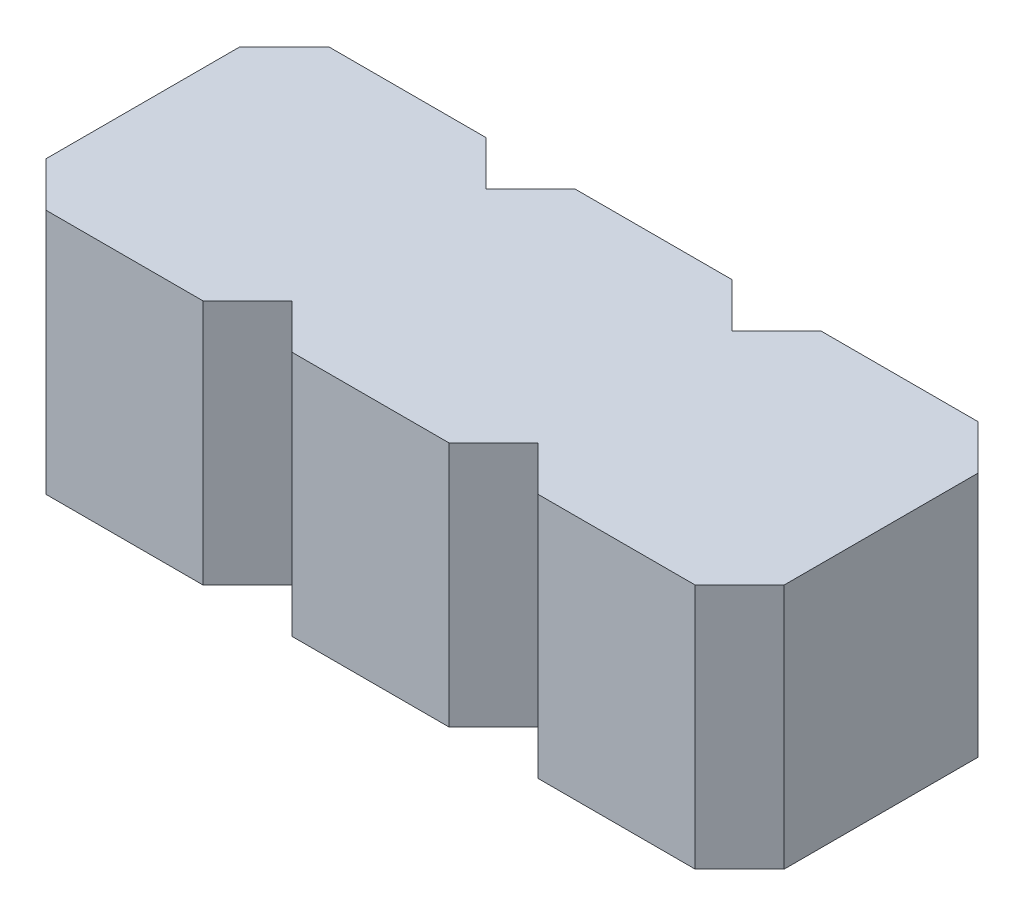
ISO-10303-21;
HEADER;
FILE_DESCRIPTION(('STEP AP214'),'2;1');
FILE_NAME('part.step','',(''),(''),'','','');
FILE_SCHEMA(('AUTOMOTIVE_DESIGN { 1 0 10303 214 1 1 1 1 }'));
ENDSEC;
DATA;
#1=APPLICATION_CONTEXT('core data for automotive mechanical design processes');
#2=APPLICATION_PROTOCOL_DEFINITION('international standard','automotive_design',2000,#1);
#3=PRODUCT_CONTEXT('',#1,'mechanical');
#4=PRODUCT('Part','Part','',(#3));
#5=PRODUCT_RELATED_PRODUCT_CATEGORY('part','',(#4));
#6=PRODUCT_DEFINITION_FORMATION('','',#4);
#7=PRODUCT_DEFINITION_CONTEXT('part definition',#1,'design');
#8=PRODUCT_DEFINITION('design','',#6,#7);
#9=PRODUCT_DEFINITION_SHAPE('','',#8);
#10=(LENGTH_UNIT() NAMED_UNIT(*) SI_UNIT(.MILLI.,.METRE.));
#11=(NAMED_UNIT(*) PLANE_ANGLE_UNIT() SI_UNIT($,.RADIAN.));
#12=(NAMED_UNIT(*) SI_UNIT($,.STERADIAN.) SOLID_ANGLE_UNIT());
#13=UNCERTAINTY_MEASURE_WITH_UNIT(LENGTH_MEASURE(1.E-05),#10,'distance_accuracy_value','');
#14=(GEOMETRIC_REPRESENTATION_CONTEXT(3) GLOBAL_UNCERTAINTY_ASSIGNED_CONTEXT((#13)) GLOBAL_UNIT_ASSIGNED_CONTEXT((#10,
#11,#12)) REPRESENTATION_CONTEXT('',''));
#15=CARTESIAN_POINT('',(0.,0.,0.));
#16=DIRECTION('',(0.,0.,1.));
#17=DIRECTION('',(1.,0.,0.));
#18=AXIS2_PLACEMENT_3D('',#15,#16,#17);
#19=CARTESIAN_POINT('',(2.54,0.,1.46));
#20=DIRECTION('',(0.,0.,1.));
#21=DIRECTION('',(1.,0.,0.));
#22=AXIS2_PLACEMENT_3D('',#19,#20,#21);
#23=PLANE('',#22);
#24=DIRECTION('',(1.,0.,0.));
#25=VECTOR('',#24,1.);
#26=CARTESIAN_POINT('',(2.54,0.,1.46));
#27=LINE('',#26,#25);
#28=CARTESIAN_POINT('',(1.73,0.,1.46));
#29=VERTEX_POINT('',#28);
#30=CARTESIAN_POINT('',(3.35,0.,1.46));
#31=VERTEX_POINT('',#30);
#32=EDGE_CURVE('E163',#29,#31,#27,.T.);
#33=ORIENTED_EDGE('',*,*,#32,.T.);
#34=DIRECTION('',(0.,1.,0.));
#35=VECTOR('',#34,1.);
#36=CARTESIAN_POINT('',(3.35,0.,1.46));
#37=LINE('',#36,#35);
#38=CARTESIAN_POINT('',(3.35,2.54,1.46));
#39=VERTEX_POINT('',#38);
#40=EDGE_CURVE('E187',#39,#31,#37,.F.);
#41=ORIENTED_EDGE('',*,*,#40,.F.);
#42=DIRECTION('',(1.,0.,0.));
#43=VECTOR('',#42,1.);
#44=CARTESIAN_POINT('',(2.54,2.54,1.46));
#45=LINE('',#44,#43);
#46=CARTESIAN_POINT('',(1.73,2.54,1.46));
#47=VERTEX_POINT('',#46);
#48=EDGE_CURVE('E19',#39,#47,#45,.F.);
#49=ORIENTED_EDGE('',*,*,#48,.T.);
#50=DIRECTION('',(0.,1.,0.));
#51=VECTOR('',#50,1.);
#52=CARTESIAN_POINT('',(1.73,0.,1.46));
#53=LINE('',#52,#51);
#54=EDGE_CURVE('E184',#29,#47,#53,.T.);
#55=ORIENTED_EDGE('',*,*,#54,.F.);
#56=EDGE_LOOP('',(#33,#41,#49,#55));
#57=FACE_BOUND('',#56,.T.);
#58=ADVANCED_FACE('F16',(#57),#23,.T.);
#59=CARTESIAN_POINT('',(2.54,0.,-1.46));
#60=DIRECTION('',(0.,0.,-1.));
#61=DIRECTION('',(-1.,0.,0.));
#62=AXIS2_PLACEMENT_3D('',#59,#60,#61);
#63=PLANE('',#62);
#64=DIRECTION('',(-1.,0.,0.));
#65=VECTOR('',#64,1.);
#66=CARTESIAN_POINT('',(2.54,0.,-1.46));
#67=LINE('',#66,#65);
#68=CARTESIAN_POINT('',(3.35,0.,-1.46));
#69=VERTEX_POINT('',#68);
#70=CARTESIAN_POINT('',(1.73,0.,-1.46));
#71=VERTEX_POINT('',#70);
#72=EDGE_CURVE('E150',#69,#71,#67,.T.);
#73=ORIENTED_EDGE('',*,*,#72,.T.);
#74=DIRECTION('',(0.,1.,0.));
#75=VECTOR('',#74,1.);
#76=CARTESIAN_POINT('',(1.73,0.,-1.46));
#77=LINE('',#76,#75);
#78=CARTESIAN_POINT('',(1.73,2.54,-1.46));
#79=VERTEX_POINT('',#78);
#80=EDGE_CURVE('E166',#79,#71,#77,.F.);
#81=ORIENTED_EDGE('',*,*,#80,.F.);
#82=DIRECTION('',(-1.,0.,0.));
#83=VECTOR('',#82,1.);
#84=CARTESIAN_POINT('',(2.54,2.54,-1.46));
#85=LINE('',#84,#83);
#86=CARTESIAN_POINT('',(3.35,2.54,-1.46));
#87=VERTEX_POINT('',#86);
#88=EDGE_CURVE('E155',#79,#87,#85,.F.);
#89=ORIENTED_EDGE('',*,*,#88,.T.);
#90=DIRECTION('',(0.,1.,0.));
#91=VECTOR('',#90,1.);
#92=CARTESIAN_POINT('',(3.35,0.,-1.46));
#93=LINE('',#92,#91);
#94=EDGE_CURVE('E217',#69,#87,#93,.T.);
#95=ORIENTED_EDGE('',*,*,#94,.F.);
#96=EDGE_LOOP('',(#73,#81,#89,#95));
#97=FACE_BOUND('',#96,.T.);
#98=ADVANCED_FACE('F167',(#97),#63,.T.);
#99=CARTESIAN_POINT('',(1.5,0.,-1.23));
#100=DIRECTION('',(-0.707106781186548,0.,-0.707106781186547));
#101=DIRECTION('',(-0.707106781186547,0.,0.707106781186548));
#102=AXIS2_PLACEMENT_3D('',#99,#100,#101);
#103=PLANE('',#102);
#104=DIRECTION('',(-0.707106781186547,0.,0.707106781186548));
#105=VECTOR('',#104,1.);
#106=CARTESIAN_POINT('',(1.5,0.,-1.23));
#107=LINE('',#106,#105);
#108=CARTESIAN_POINT('',(1.27,0.,-1.));
#109=VERTEX_POINT('',#108);
#110=EDGE_CURVE('E169',#71,#109,#107,.T.);
#111=ORIENTED_EDGE('',*,*,#110,.T.);
#112=DIRECTION('',(0.,1.,0.));
#113=VECTOR('',#112,1.);
#114=CARTESIAN_POINT('',(1.27,0.,-1.));
#115=LINE('',#114,#113);
#116=CARTESIAN_POINT('',(1.27,2.54,-1.));
#117=VERTEX_POINT('',#116);
#118=EDGE_CURVE('E173',#117,#109,#115,.F.);
#119=ORIENTED_EDGE('',*,*,#118,.F.);
#120=DIRECTION('',(-0.707106781186547,0.,0.707106781186548));
#121=VECTOR('',#120,1.);
#122=CARTESIAN_POINT('',(1.5,2.54,-1.23));
#123=LINE('',#122,#121);
#124=EDGE_CURVE('E158',#117,#79,#123,.F.);
#125=ORIENTED_EDGE('',*,*,#124,.T.);
#126=ORIENTED_EDGE('',*,*,#80,.T.);
#127=EDGE_LOOP('',(#111,#119,#125,#126));
#128=FACE_BOUND('',#127,.T.);
#129=ADVANCED_FACE('F171',(#128),#103,.T.);
#130=CARTESIAN_POINT('',(1.5,0.,1.23));
#131=DIRECTION('',(-0.707106781186546,0.,0.707106781186549));
#132=DIRECTION('',(0.707106781186549,0.,0.707106781186546));
#133=AXIS2_PLACEMENT_3D('',#130,#131,#132);
#134=PLANE('',#133);
#135=DIRECTION('',(0.707106781186549,0.,0.707106781186546));
#136=VECTOR('',#135,1.);
#137=CARTESIAN_POINT('',(1.5,0.,1.23));
#138=LINE('',#137,#136);
#139=CARTESIAN_POINT('',(1.27,0.,1.));
#140=VERTEX_POINT('',#139);
#141=EDGE_CURVE('E195',#140,#29,#138,.T.);
#142=ORIENTED_EDGE('',*,*,#141,.T.);
#143=ORIENTED_EDGE('',*,*,#54,.T.);
#144=DIRECTION('',(0.707106781186549,0.,0.707106781186546));
#145=VECTOR('',#144,1.);
#146=CARTESIAN_POINT('',(1.5,2.54,1.23));
#147=LINE('',#146,#145);
#148=CARTESIAN_POINT('',(1.27,2.54,1.));
#149=VERTEX_POINT('',#148);
#150=EDGE_CURVE('E193',#47,#149,#147,.F.);
#151=ORIENTED_EDGE('',*,*,#150,.T.);
#152=DIRECTION('',(0.,1.,0.));
#153=VECTOR('',#152,1.);
#154=CARTESIAN_POINT('',(1.27,0.,0.999999999999999));
#155=LINE('',#154,#153);
#156=EDGE_CURVE('E240',#140,#149,#155,.T.);
#157=ORIENTED_EDGE('',*,*,#156,.F.);
#158=EDGE_LOOP('',(#142,#143,#151,#157));
#159=FACE_BOUND('',#158,.T.);
#160=ADVANCED_FACE('F191',(#159),#134,.T.);
#161=CARTESIAN_POINT('',(3.58,0.,1.23));
#162=DIRECTION('',(0.707106781186549,0.,0.707106781186546));
#163=DIRECTION('',(0.707106781186546,0.,-0.707106781186549));
#164=AXIS2_PLACEMENT_3D('',#161,#162,#163);
#165=PLANE('',#164);
#166=DIRECTION('',(0.707106781186546,0.,-0.707106781186549));
#167=VECTOR('',#166,1.);
#168=CARTESIAN_POINT('',(3.58,0.,1.23));
#169=LINE('',#168,#167);
#170=CARTESIAN_POINT('',(3.81,0.,1.));
#171=VERTEX_POINT('',#170);
#172=EDGE_CURVE('E226',#31,#171,#169,.T.);
#173=ORIENTED_EDGE('',*,*,#172,.T.);
#174=DIRECTION('',(0.,1.,0.));
#175=VECTOR('',#174,1.);
#176=CARTESIAN_POINT('',(3.81,0.,1.));
#177=LINE('',#176,#175);
#178=CARTESIAN_POINT('',(3.81,2.54,1.));
#179=VERTEX_POINT('',#178);
#180=EDGE_CURVE('E232',#179,#171,#177,.F.);
#181=ORIENTED_EDGE('',*,*,#180,.F.);
#182=DIRECTION('',(0.707106781186546,0.,-0.707106781186549));
#183=VECTOR('',#182,1.);
#184=CARTESIAN_POINT('',(3.58,2.54,1.23));
#185=LINE('',#184,#183);
#186=EDGE_CURVE('E196',#179,#39,#185,.F.);
#187=ORIENTED_EDGE('',*,*,#186,.T.);
#188=ORIENTED_EDGE('',*,*,#40,.T.);
#189=EDGE_LOOP('',(#173,#181,#187,#188));
#190=FACE_BOUND('',#189,.T.);
#191=ADVANCED_FACE('F228',(#190),#165,.T.);
#192=CARTESIAN_POINT('',(3.58,0.,-1.23));
#193=DIRECTION('',(0.707106781186548,0.,-0.707106781186547));
#194=DIRECTION('',(-0.707106781186547,0.,-0.707106781186548));
#195=AXIS2_PLACEMENT_3D('',#192,#193,#194);
#196=PLANE('',#195);
#197=DIRECTION('',(-0.707106781186547,0.,-0.707106781186548));
#198=VECTOR('',#197,1.);
#199=CARTESIAN_POINT('',(3.58,0.,-1.23));
#200=LINE('',#199,#198);
#201=CARTESIAN_POINT('',(3.81,0.,-1.));
#202=VERTEX_POINT('',#201);
#203=EDGE_CURVE('E222',#202,#69,#200,.T.);
#204=ORIENTED_EDGE('',*,*,#203,.T.);
#205=ORIENTED_EDGE('',*,*,#94,.T.);
#206=DIRECTION('',(-0.707106781186547,0.,-0.707106781186548));
#207=VECTOR('',#206,1.);
#208=CARTESIAN_POINT('',(3.58,2.54,-1.23));
#209=LINE('',#208,#207);
#210=CARTESIAN_POINT('',(3.81,2.54,-1.));
#211=VERTEX_POINT('',#210);
#212=EDGE_CURVE('E161',#87,#211,#209,.F.);
#213=ORIENTED_EDGE('',*,*,#212,.T.);
#214=DIRECTION('',(0.,1.,0.));
#215=VECTOR('',#214,1.);
#216=CARTESIAN_POINT('',(3.81,0.,-1.));
#217=LINE('',#216,#215);
#218=EDGE_CURVE('E272',#202,#211,#217,.T.);
#219=ORIENTED_EDGE('',*,*,#218,.F.);
#220=EDGE_LOOP('',(#204,#205,#213,#219));
#221=FACE_BOUND('',#220,.T.);
#222=ADVANCED_FACE('F497',(#221),#196,.T.);
#223=CARTESIAN_POINT('',(1.04,0.,-1.23));
#224=DIRECTION('',(0.707106781186548,0.,-0.707106781186547));
#225=DIRECTION('',(-0.707106781186547,0.,-0.707106781186548));
#226=AXIS2_PLACEMENT_3D('',#223,#224,#225);
#227=PLANE('',#226);
#228=DIRECTION('',(-0.707106781186547,0.,-0.707106781186548));
#229=VECTOR('',#228,1.);
#230=CARTESIAN_POINT('',(1.04,0.,-1.23));
#231=LINE('',#230,#229);
#232=CARTESIAN_POINT('',(0.81,0.,-1.46));
#233=VERTEX_POINT('',#232);
#234=EDGE_CURVE('E205',#109,#233,#231,.T.);
#235=ORIENTED_EDGE('',*,*,#234,.T.);
#236=DIRECTION('',(0.,1.,0.));
#237=VECTOR('',#236,1.);
#238=CARTESIAN_POINT('',(0.81,0.,-1.46));
#239=LINE('',#238,#237);
#240=CARTESIAN_POINT('',(0.81,2.54,-1.46));
#241=VERTEX_POINT('',#240);
#242=EDGE_CURVE('E267',#241,#233,#239,.F.);
#243=ORIENTED_EDGE('',*,*,#242,.F.);
#244=DIRECTION('',(-0.707106781186547,0.,-0.707106781186548));
#245=VECTOR('',#244,1.);
#246=CARTESIAN_POINT('',(1.04,2.54,-1.23));
#247=LINE('',#246,#245);
#248=EDGE_CURVE('E215',#241,#117,#247,.F.);
#249=ORIENTED_EDGE('',*,*,#248,.T.);
#250=ORIENTED_EDGE('',*,*,#118,.T.);
#251=EDGE_LOOP('',(#235,#243,#249,#250));
#252=FACE_BOUND('',#251,.T.);
#253=ADVANCED_FACE('F214',(#252),#227,.T.);
#254=CARTESIAN_POINT('',(1.04,0.,1.23));
#255=DIRECTION('',(0.707106781186549,0.,0.707106781186546));
#256=DIRECTION('',(0.707106781186546,0.,-0.707106781186549));
#257=AXIS2_PLACEMENT_3D('',#254,#255,#256);
#258=PLANE('',#257);
#259=DIRECTION('',(0.707106781186546,0.,-0.707106781186549));
#260=VECTOR('',#259,1.);
#261=CARTESIAN_POINT('',(1.04,0.,1.23));
#262=LINE('',#261,#260);
#263=CARTESIAN_POINT('',(0.810000000000002,0.,1.46));
#264=VERTEX_POINT('',#263);
#265=EDGE_CURVE('E284',#264,#140,#262,.T.);
#266=ORIENTED_EDGE('',*,*,#265,.T.);
#267=ORIENTED_EDGE('',*,*,#156,.T.);
#268=DIRECTION('',(0.707106781186546,0.,-0.707106781186549));
#269=VECTOR('',#268,1.);
#270=CARTESIAN_POINT('',(1.04,2.54,1.23));
#271=LINE('',#270,#269);
#272=CARTESIAN_POINT('',(0.810000000000002,2.54,1.46));
#273=VERTEX_POINT('',#272);
#274=EDGE_CURVE('E212',#149,#273,#271,.F.);
#275=ORIENTED_EDGE('',*,*,#274,.T.);
#276=DIRECTION('',(0.,1.,0.));
#277=VECTOR('',#276,1.);
#278=CARTESIAN_POINT('',(0.810000000000002,0.,1.46));
#279=LINE('',#278,#277);
#280=EDGE_CURVE('E254',#264,#273,#279,.T.);
#281=ORIENTED_EDGE('',*,*,#280,.F.);
#282=EDGE_LOOP('',(#266,#267,#275,#281));
#283=FACE_BOUND('',#282,.T.);
#284=ADVANCED_FACE('F289',(#283),#258,.T.);
#285=CARTESIAN_POINT('',(4.04,0.,1.23));
#286=DIRECTION('',(-0.707106781186546,0.,0.707106781186549));
#287=DIRECTION('',(0.707106781186549,0.,0.707106781186546));
#288=AXIS2_PLACEMENT_3D('',#285,#286,#287);
#289=PLANE('',#288);
#290=DIRECTION('',(0.707106781186549,0.,0.707106781186546));
#291=VECTOR('',#290,1.);
#292=CARTESIAN_POINT('',(4.04,0.,1.23));
#293=LINE('',#292,#291);
#294=CARTESIAN_POINT('',(4.27,0.,1.46));
#295=VERTEX_POINT('',#294);
#296=EDGE_CURVE('E245',#171,#295,#293,.T.);
#297=ORIENTED_EDGE('',*,*,#296,.T.);
#298=DIRECTION('',(0.,1.,0.));
#299=VECTOR('',#298,1.);
#300=CARTESIAN_POINT('',(4.27,0.,1.46));
#301=LINE('',#300,#299);
#302=CARTESIAN_POINT('',(4.27,2.54,1.46));
#303=VERTEX_POINT('',#302);
#304=EDGE_CURVE('E243',#303,#295,#301,.F.);
#305=ORIENTED_EDGE('',*,*,#304,.F.);
#306=DIRECTION('',(0.707106781186549,0.,0.707106781186546));
#307=VECTOR('',#306,1.);
#308=CARTESIAN_POINT('',(4.04,2.54,1.23));
#309=LINE('',#308,#307);
#310=EDGE_CURVE('E234',#303,#179,#309,.F.);
#311=ORIENTED_EDGE('',*,*,#310,.T.);
#312=ORIENTED_EDGE('',*,*,#180,.T.);
#313=EDGE_LOOP('',(#297,#305,#311,#312));
#314=FACE_BOUND('',#313,.T.);
#315=ADVANCED_FACE('F244',(#314),#289,.T.);
#316=CARTESIAN_POINT('',(4.04,0.,-1.23));
#317=DIRECTION('',(-0.707106781186548,0.,-0.707106781186547));
#318=DIRECTION('',(-0.707106781186547,0.,0.707106781186548));
#319=AXIS2_PLACEMENT_3D('',#316,#317,#318);
#320=PLANE('',#319);
#321=DIRECTION('',(-0.707106781186547,0.,0.707106781186548));
#322=VECTOR('',#321,1.);
#323=CARTESIAN_POINT('',(4.04,0.,-1.23));
#324=LINE('',#323,#322);
#325=CARTESIAN_POINT('',(4.27,0.,-1.46));
#326=VERTEX_POINT('',#325);
#327=EDGE_CURVE('E275',#326,#202,#324,.T.);
#328=ORIENTED_EDGE('',*,*,#327,.T.);
#329=ORIENTED_EDGE('',*,*,#218,.T.);
#330=DIRECTION('',(-0.707106781186547,0.,0.707106781186548));
#331=VECTOR('',#330,1.);
#332=CARTESIAN_POINT('',(4.04,2.54,-1.23));
#333=LINE('',#332,#331);
#334=CARTESIAN_POINT('',(4.27,2.54,-1.46));
#335=VERTEX_POINT('',#334);
#336=EDGE_CURVE('E278',#211,#335,#333,.F.);
#337=ORIENTED_EDGE('',*,*,#336,.T.);
#338=DIRECTION('',(0.,1.,0.));
#339=VECTOR('',#338,1.);
#340=CARTESIAN_POINT('',(4.27,0.,-1.46));
#341=LINE('',#340,#339);
#342=EDGE_CURVE('E304',#326,#335,#341,.T.);
#343=ORIENTED_EDGE('',*,*,#342,.F.);
#344=EDGE_LOOP('',(#328,#329,#337,#343));
#345=FACE_BOUND('',#344,.T.);
#346=ADVANCED_FACE('F466',(#345),#320,.T.);
#347=CARTESIAN_POINT('',(0.,0.,-1.46));
#348=DIRECTION('',(0.,0.,-1.));
#349=DIRECTION('',(-1.,0.,0.));
#350=AXIS2_PLACEMENT_3D('',#347,#348,#349);
#351=PLANE('',#350);
#352=DIRECTION('',(-1.,0.,0.));
#353=VECTOR('',#352,1.);
#354=CARTESIAN_POINT('',(0.,0.,-1.46));
#355=LINE('',#354,#353);
#356=CARTESIAN_POINT('',(-0.810000000000001,0.,-1.46));
#357=VERTEX_POINT('',#356);
#358=EDGE_CURVE('E208',#233,#357,#355,.T.);
#359=ORIENTED_EDGE('',*,*,#358,.T.);
#360=DIRECTION('',(0.,1.,0.));
#361=VECTOR('',#360,1.);
#362=CARTESIAN_POINT('',(-0.810000000000001,0.,-1.46));
#363=LINE('',#362,#361);
#364=CARTESIAN_POINT('',(-0.810000000000001,2.54,-1.46));
#365=VERTEX_POINT('',#364);
#366=EDGE_CURVE('E312',#365,#357,#363,.F.);
#367=ORIENTED_EDGE('',*,*,#366,.F.);
#368=DIRECTION('',(-1.,0.,0.));
#369=VECTOR('',#368,1.);
#370=CARTESIAN_POINT('',(0.,2.54,-1.46));
#371=LINE('',#370,#369);
#372=EDGE_CURVE('E269',#365,#241,#371,.F.);
#373=ORIENTED_EDGE('',*,*,#372,.T.);
#374=ORIENTED_EDGE('',*,*,#242,.T.);
#375=EDGE_LOOP('',(#359,#367,#373,#374));
#376=FACE_BOUND('',#375,.T.);
#377=ADVANCED_FACE('F458',(#376),#351,.T.);
#378=CARTESIAN_POINT('',(0.,0.,1.46));
#379=DIRECTION('',(0.,0.,1.));
#380=DIRECTION('',(1.,0.,0.));
#381=AXIS2_PLACEMENT_3D('',#378,#379,#380);
#382=PLANE('',#381);
#383=DIRECTION('',(1.,0.,0.));
#384=VECTOR('',#383,1.);
#385=CARTESIAN_POINT('',(0.,0.,1.46));
#386=LINE('',#385,#384);
#387=CARTESIAN_POINT('',(-0.809999999999998,0.,1.46));
#388=VERTEX_POINT('',#387);
#389=EDGE_CURVE('E257',#388,#264,#386,.T.);
#390=ORIENTED_EDGE('',*,*,#389,.T.);
#391=ORIENTED_EDGE('',*,*,#280,.T.);
#392=DIRECTION('',(1.,0.,0.));
#393=VECTOR('',#392,1.);
#394=CARTESIAN_POINT('',(0.,2.54,1.46));
#395=LINE('',#394,#393);
#396=CARTESIAN_POINT('',(-0.809999999999998,2.54,1.46));
#397=VERTEX_POINT('',#396);
#398=EDGE_CURVE('E263',#273,#397,#395,.F.);
#399=ORIENTED_EDGE('',*,*,#398,.T.);
#400=DIRECTION('',(0.,1.,0.));
#401=VECTOR('',#400,1.);
#402=CARTESIAN_POINT('',(-0.809999999999998,0.,1.46));
#403=LINE('',#402,#401);
#404=EDGE_CURVE('E294',#388,#397,#403,.T.);
#405=ORIENTED_EDGE('',*,*,#404,.F.);
#406=EDGE_LOOP('',(#390,#391,#399,#405));
#407=FACE_BOUND('',#406,.T.);
#408=ADVANCED_FACE('F291',(#407),#382,.T.);
#409=CARTESIAN_POINT('',(5.08,0.,1.46));
#410=DIRECTION('',(0.,0.,1.));
#411=DIRECTION('',(1.,0.,0.));
#412=AXIS2_PLACEMENT_3D('',#409,#410,#411);
#413=PLANE('',#412);
#414=DIRECTION('',(1.,0.,0.));
#415=VECTOR('',#414,1.);
#416=CARTESIAN_POINT('',(5.08,0.,1.46));
#417=LINE('',#416,#415);
#418=CARTESIAN_POINT('',(5.89,0.,1.46));
#419=VERTEX_POINT('',#418);
#420=EDGE_CURVE('E248',#295,#419,#417,.T.);
#421=ORIENTED_EDGE('',*,*,#420,.T.);
#422=DIRECTION('',(0.,1.,0.));
#423=VECTOR('',#422,1.);
#424=CARTESIAN_POINT('',(5.89,0.,1.46));
#425=LINE('',#424,#423);
#426=CARTESIAN_POINT('',(5.89,2.54,1.46));
#427=VERTEX_POINT('',#426);
#428=EDGE_CURVE('E252',#427,#419,#425,.F.);
#429=ORIENTED_EDGE('',*,*,#428,.F.);
#430=DIRECTION('',(1.,0.,0.));
#431=VECTOR('',#430,1.);
#432=CARTESIAN_POINT('',(5.08,2.54,1.46));
#433=LINE('',#432,#431);
#434=EDGE_CURVE('E237',#427,#303,#433,.F.);
#435=ORIENTED_EDGE('',*,*,#434,.T.);
#436=ORIENTED_EDGE('',*,*,#304,.T.);
#437=EDGE_LOOP('',(#421,#429,#435,#436));
#438=FACE_BOUND('',#437,.T.);
#439=ADVANCED_FACE('F250',(#438),#413,.T.);
#440=CARTESIAN_POINT('',(5.08,0.,-1.46));
#441=DIRECTION('',(0.,0.,-1.));
#442=DIRECTION('',(-1.,0.,0.));
#443=AXIS2_PLACEMENT_3D('',#440,#441,#442);
#444=PLANE('',#443);
#445=DIRECTION('',(1.,0.,0.));
#446=VECTOR('',#445,1.);
#447=CARTESIAN_POINT('',(0.,0.,-1.46));
#448=LINE('',#447,#446);
#449=CARTESIAN_POINT('',(5.89,0.,-1.46));
#450=VERTEX_POINT('',#449);
#451=EDGE_CURVE('E325',#450,#326,#448,.F.);
#452=ORIENTED_EDGE('',*,*,#451,.T.);
#453=ORIENTED_EDGE('',*,*,#342,.T.);
#454=DIRECTION('',(-1.,0.,0.));
#455=VECTOR('',#454,1.);
#456=CARTESIAN_POINT('',(5.08,2.54,-1.46));
#457=LINE('',#456,#455);
#458=CARTESIAN_POINT('',(5.89,2.54,-1.46));
#459=VERTEX_POINT('',#458);
#460=EDGE_CURVE('E302',#335,#459,#457,.F.);
#461=ORIENTED_EDGE('',*,*,#460,.T.);
#462=DIRECTION('',(0.,1.,0.));
#463=VECTOR('',#462,1.);
#464=CARTESIAN_POINT('',(5.89,0.,-1.46));
#465=LINE('',#464,#463);
#466=EDGE_CURVE('E332',#450,#459,#465,.T.);
#467=ORIENTED_EDGE('',*,*,#466,.F.);
#468=EDGE_LOOP('',(#452,#453,#461,#467));
#469=FACE_BOUND('',#468,.T.);
#470=ADVANCED_FACE('F369',(#469),#444,.T.);
#471=CARTESIAN_POINT('',(-1.04,0.,-1.23));
#472=DIRECTION('',(-0.707106781186548,0.,-0.707106781186547));
#473=DIRECTION('',(-0.707106781186547,0.,0.707106781186548));
#474=AXIS2_PLACEMENT_3D('',#471,#472,#473);
#475=PLANE('',#474);
#476=DIRECTION('',(-0.707106781186547,0.,0.707106781186548));
#477=VECTOR('',#476,1.);
#478=CARTESIAN_POINT('',(-0.810000000000001,0.,-1.46));
#479=LINE('',#478,#477);
#480=CARTESIAN_POINT('',(-1.27,0.,-1.));
#481=VERTEX_POINT('',#480);
#482=EDGE_CURVE('E321',#357,#481,#479,.T.);
#483=ORIENTED_EDGE('',*,*,#482,.T.);
#484=DIRECTION('',(0.,1.,0.));
#485=VECTOR('',#484,1.);
#486=CARTESIAN_POINT('',(-1.27,0.,-1.));
#487=LINE('',#486,#485);
#488=CARTESIAN_POINT('',(-1.27,2.54,-1.));
#489=VERTEX_POINT('',#488);
#490=EDGE_CURVE('E334',#489,#481,#487,.F.);
#491=ORIENTED_EDGE('',*,*,#490,.F.);
#492=DIRECTION('',(-0.707106781186547,0.,0.707106781186548));
#493=VECTOR('',#492,1.);
#494=CARTESIAN_POINT('',(-1.04,2.54,-1.23));
#495=LINE('',#494,#493);
#496=EDGE_CURVE('E309',#489,#365,#495,.F.);
#497=ORIENTED_EDGE('',*,*,#496,.T.);
#498=ORIENTED_EDGE('',*,*,#366,.T.);
#499=EDGE_LOOP('',(#483,#491,#497,#498));
#500=FACE_BOUND('',#499,.T.);
#501=ADVANCED_FACE('F360',(#500),#475,.T.);
#502=CARTESIAN_POINT('',(-1.04,0.,1.23));
#503=DIRECTION('',(-0.707106781186546,0.,0.707106781186549));
#504=DIRECTION('',(0.707106781186549,0.,0.707106781186546));
#505=AXIS2_PLACEMENT_3D('',#502,#503,#504);
#506=PLANE('',#505);
#507=DIRECTION('',(0.707106781186549,0.,0.707106781186546));
#508=VECTOR('',#507,1.);
#509=CARTESIAN_POINT('',(-1.27,0.,1.));
#510=LINE('',#509,#508);
#511=CARTESIAN_POINT('',(-1.27,0.,1.));
#512=VERTEX_POINT('',#511);
#513=EDGE_CURVE('E297',#512,#388,#510,.T.);
#514=ORIENTED_EDGE('',*,*,#513,.T.);
#515=ORIENTED_EDGE('',*,*,#404,.T.);
#516=DIRECTION('',(0.707106781186549,0.,0.707106781186546));
#517=VECTOR('',#516,1.);
#518=CARTESIAN_POINT('',(-1.04,2.54,1.23));
#519=LINE('',#518,#517);
#520=CARTESIAN_POINT('',(-1.27,2.54,1.));
#521=VERTEX_POINT('',#520);
#522=EDGE_CURVE('E315',#397,#521,#519,.F.);
#523=ORIENTED_EDGE('',*,*,#522,.T.);
#524=DIRECTION('',(0.,1.,0.));
#525=VECTOR('',#524,1.);
#526=CARTESIAN_POINT('',(-1.27,0.,1.));
#527=LINE('',#526,#525);
#528=EDGE_CURVE('E340',#512,#521,#527,.T.);
#529=ORIENTED_EDGE('',*,*,#528,.F.);
#530=EDGE_LOOP('',(#514,#515,#523,#529));
#531=FACE_BOUND('',#530,.T.);
#532=ADVANCED_FACE('F357',(#531),#506,.T.);
#533=CARTESIAN_POINT('',(6.12,0.,1.23));
#534=DIRECTION('',(0.707106781186549,0.,0.707106781186546));
#535=DIRECTION('',(0.707106781186546,0.,-0.707106781186549));
#536=AXIS2_PLACEMENT_3D('',#533,#534,#535);
#537=PLANE('',#536);
#538=DIRECTION('',(0.707106781186548,0.,-0.707106781186546));
#539=VECTOR('',#538,1.);
#540=CARTESIAN_POINT('',(5.89,0.,1.46));
#541=LINE('',#540,#539);
#542=CARTESIAN_POINT('',(6.35,0.,1.));
#543=VERTEX_POINT('',#542);
#544=EDGE_CURVE('E301',#419,#543,#541,.T.);
#545=ORIENTED_EDGE('',*,*,#544,.T.);
#546=DIRECTION('',(0.,1.,0.));
#547=VECTOR('',#546,1.);
#548=CARTESIAN_POINT('',(6.35,0.,1.));
#549=LINE('',#548,#547);
#550=CARTESIAN_POINT('',(6.35,2.54,1.));
#551=VERTEX_POINT('',#550);
#552=EDGE_CURVE('E343',#551,#543,#549,.F.);
#553=ORIENTED_EDGE('',*,*,#552,.F.);
#554=DIRECTION('',(0.707106781186546,0.,-0.707106781186549));
#555=VECTOR('',#554,1.);
#556=CARTESIAN_POINT('',(6.12,2.54,1.23));
#557=LINE('',#556,#555);
#558=EDGE_CURVE('E318',#551,#427,#557,.F.);
#559=ORIENTED_EDGE('',*,*,#558,.T.);
#560=ORIENTED_EDGE('',*,*,#428,.T.);
#561=EDGE_LOOP('',(#545,#553,#559,#560));
#562=FACE_BOUND('',#561,.T.);
#563=ADVANCED_FACE('F359',(#562),#537,.T.);
#564=CARTESIAN_POINT('',(0.,0.,0.));
#565=DIRECTION('',(0.,1.,0.));
#566=DIRECTION('',(0.,0.,1.));
#567=AXIS2_PLACEMENT_3D('',#564,#565,#566);
#568=PLANE('',#567);
#569=ORIENTED_EDGE('',*,*,#110,.F.);
#570=ORIENTED_EDGE('',*,*,#72,.F.);
#571=ORIENTED_EDGE('',*,*,#203,.F.);
#572=ORIENTED_EDGE('',*,*,#327,.F.);
#573=ORIENTED_EDGE('',*,*,#451,.F.);
#574=DIRECTION('',(-0.707106781186548,0.,-0.707106781186547));
#575=VECTOR('',#574,1.);
#576=CARTESIAN_POINT('',(6.12,0.,-1.23));
#577=LINE('',#576,#575);
#578=CARTESIAN_POINT('',(6.35,0.,-1.));
#579=VERTEX_POINT('',#578);
#580=EDGE_CURVE('E329',#579,#450,#577,.T.);
#581=ORIENTED_EDGE('',*,*,#580,.F.);
#582=DIRECTION('',(0.,0.,-1.));
#583=VECTOR('',#582,1.);
#584=CARTESIAN_POINT('',(6.35,0.,0.));
#585=LINE('',#584,#583);
#586=EDGE_CURVE('E346',#543,#579,#585,.T.);
#587=ORIENTED_EDGE('',*,*,#586,.F.);
#588=ORIENTED_EDGE('',*,*,#544,.F.);
#589=ORIENTED_EDGE('',*,*,#420,.F.);
#590=ORIENTED_EDGE('',*,*,#296,.F.);
#591=ORIENTED_EDGE('',*,*,#172,.F.);
#592=ORIENTED_EDGE('',*,*,#32,.F.);
#593=ORIENTED_EDGE('',*,*,#141,.F.);
#594=ORIENTED_EDGE('',*,*,#265,.F.);
#595=ORIENTED_EDGE('',*,*,#389,.F.);
#596=ORIENTED_EDGE('',*,*,#513,.F.);
#597=DIRECTION('',(0.,0.,1.));
#598=VECTOR('',#597,1.);
#599=CARTESIAN_POINT('',(-1.27,0.,0.));
#600=LINE('',#599,#598);
#601=EDGE_CURVE('E337',#481,#512,#600,.T.);
#602=ORIENTED_EDGE('',*,*,#601,.F.);
#603=ORIENTED_EDGE('',*,*,#482,.F.);
#604=ORIENTED_EDGE('',*,*,#358,.F.);
#605=ORIENTED_EDGE('',*,*,#234,.F.);
#606=EDGE_LOOP('',(#569,#570,#571,#572,#573,#581,#587,#588,#589,#590,#591,#592,#593,#594,#595,
#596,#602,#603,#604,#605));
#607=FACE_BOUND('',#606,.T.);
#608=ADVANCED_FACE('F206',(#607),#568,.F.);
#609=CARTESIAN_POINT('',(6.12,0.,-1.23));
#610=DIRECTION('',(0.707106781186547,0.,-0.707106781186548));
#611=DIRECTION('',(-0.707106781186548,0.,-0.707106781186547));
#612=AXIS2_PLACEMENT_3D('',#609,#610,#611);
#613=PLANE('',#612);
#614=ORIENTED_EDGE('',*,*,#580,.T.);
#615=ORIENTED_EDGE('',*,*,#466,.T.);
#616=DIRECTION('',(-0.707106781186548,0.,-0.707106781186547));
#617=VECTOR('',#616,1.);
#618=CARTESIAN_POINT('',(6.12,2.54,-1.23));
#619=LINE('',#618,#617);
#620=CARTESIAN_POINT('',(6.35,2.54,-1.));
#621=VERTEX_POINT('',#620);
#622=EDGE_CURVE('E34',#459,#621,#619,.F.);
#623=ORIENTED_EDGE('',*,*,#622,.T.);
#624=DIRECTION('',(0.,1.,0.));
#625=VECTOR('',#624,1.);
#626=CARTESIAN_POINT('',(6.35,0.,-1.));
#627=LINE('',#626,#625);
#628=EDGE_CURVE('E349',#579,#621,#627,.T.);
#629=ORIENTED_EDGE('',*,*,#628,.F.);
#630=EDGE_LOOP('',(#614,#615,#623,#629));
#631=FACE_BOUND('',#630,.T.);
#632=ADVANCED_FACE('F383',(#631),#613,.T.);
#633=CARTESIAN_POINT('',(-1.27,0.,0.));
#634=DIRECTION('',(-1.,0.,0.));
#635=DIRECTION('',(0.,0.,1.));
#636=AXIS2_PLACEMENT_3D('',#633,#634,#635);
#637=PLANE('',#636);
#638=ORIENTED_EDGE('',*,*,#601,.T.);
#639=ORIENTED_EDGE('',*,*,#528,.T.);
#640=DIRECTION('',(0.,0.,1.));
#641=VECTOR('',#640,1.);
#642=CARTESIAN_POINT('',(-1.27,2.54,0.));
#643=LINE('',#642,#641);
#644=EDGE_CURVE('E25',#489,#521,#643,.T.);
#645=ORIENTED_EDGE('',*,*,#644,.F.);
#646=ORIENTED_EDGE('',*,*,#490,.T.);
#647=EDGE_LOOP('',(#638,#639,#645,#646));
#648=FACE_BOUND('',#647,.T.);
#649=ADVANCED_FACE('F355',(#648),#637,.T.);
#650=CARTESIAN_POINT('',(6.35,0.,0.));
#651=DIRECTION('',(1.,0.,0.));
#652=DIRECTION('',(0.,0.,-1.));
#653=AXIS2_PLACEMENT_3D('',#650,#651,#652);
#654=PLANE('',#653);
#655=ORIENTED_EDGE('',*,*,#586,.T.);
#656=ORIENTED_EDGE('',*,*,#628,.T.);
#657=DIRECTION('',(0.,0.,1.));
#658=VECTOR('',#657,1.);
#659=CARTESIAN_POINT('',(6.35,2.54,0.));
#660=LINE('',#659,#658);
#661=EDGE_CURVE('E11',#551,#621,#660,.F.);
#662=ORIENTED_EDGE('',*,*,#661,.F.);
#663=ORIENTED_EDGE('',*,*,#552,.T.);
#664=EDGE_LOOP('',(#655,#656,#662,#663));
#665=FACE_BOUND('',#664,.T.);
#666=ADVANCED_FACE('F373',(#665),#654,.T.);
#667=CARTESIAN_POINT('',(0.,2.54,0.));
#668=DIRECTION('',(0.,1.,0.));
#669=DIRECTION('',(0.,0.,1.));
#670=AXIS2_PLACEMENT_3D('',#667,#668,#669);
#671=PLANE('',#670);
#672=ORIENTED_EDGE('',*,*,#88,.F.);
#673=ORIENTED_EDGE('',*,*,#124,.F.);
#674=ORIENTED_EDGE('',*,*,#248,.F.);
#675=ORIENTED_EDGE('',*,*,#372,.F.);
#676=ORIENTED_EDGE('',*,*,#496,.F.);
#677=ORIENTED_EDGE('',*,*,#644,.T.);
#678=ORIENTED_EDGE('',*,*,#522,.F.);
#679=ORIENTED_EDGE('',*,*,#398,.F.);
#680=ORIENTED_EDGE('',*,*,#274,.F.);
#681=ORIENTED_EDGE('',*,*,#150,.F.);
#682=ORIENTED_EDGE('',*,*,#48,.F.);
#683=ORIENTED_EDGE('',*,*,#186,.F.);
#684=ORIENTED_EDGE('',*,*,#310,.F.);
#685=ORIENTED_EDGE('',*,*,#434,.F.);
#686=ORIENTED_EDGE('',*,*,#558,.F.);
#687=ORIENTED_EDGE('',*,*,#661,.T.);
#688=ORIENTED_EDGE('',*,*,#622,.F.);
#689=ORIENTED_EDGE('',*,*,#460,.F.);
#690=ORIENTED_EDGE('',*,*,#336,.F.);
#691=ORIENTED_EDGE('',*,*,#212,.F.);
#692=EDGE_LOOP('',(#672,#673,#674,#675,#676,#677,#678,#679,#680,#681,#682,#683,#684,#685,#686,
#687,#688,#689,#690,#691));
#693=FACE_BOUND('',#692,.T.);
#694=ADVANCED_FACE('F156',(#693),#671,.T.);
#695=CLOSED_SHELL('',(#58,#98,#129,#160,#191,#222,#253,#284,#315,#346,#377,#408,#439,#470,#501,
#532,#563,#608,#632,#649,#666,#694));
#696=MANIFOLD_SOLID_BREP('B1',#695);
#697=ADVANCED_BREP_SHAPE_REPRESENTATION('',(#18,#696),#14);
#698=SHAPE_DEFINITION_REPRESENTATION(#9,#697);
ENDSEC;
END-ISO-10303-21;
